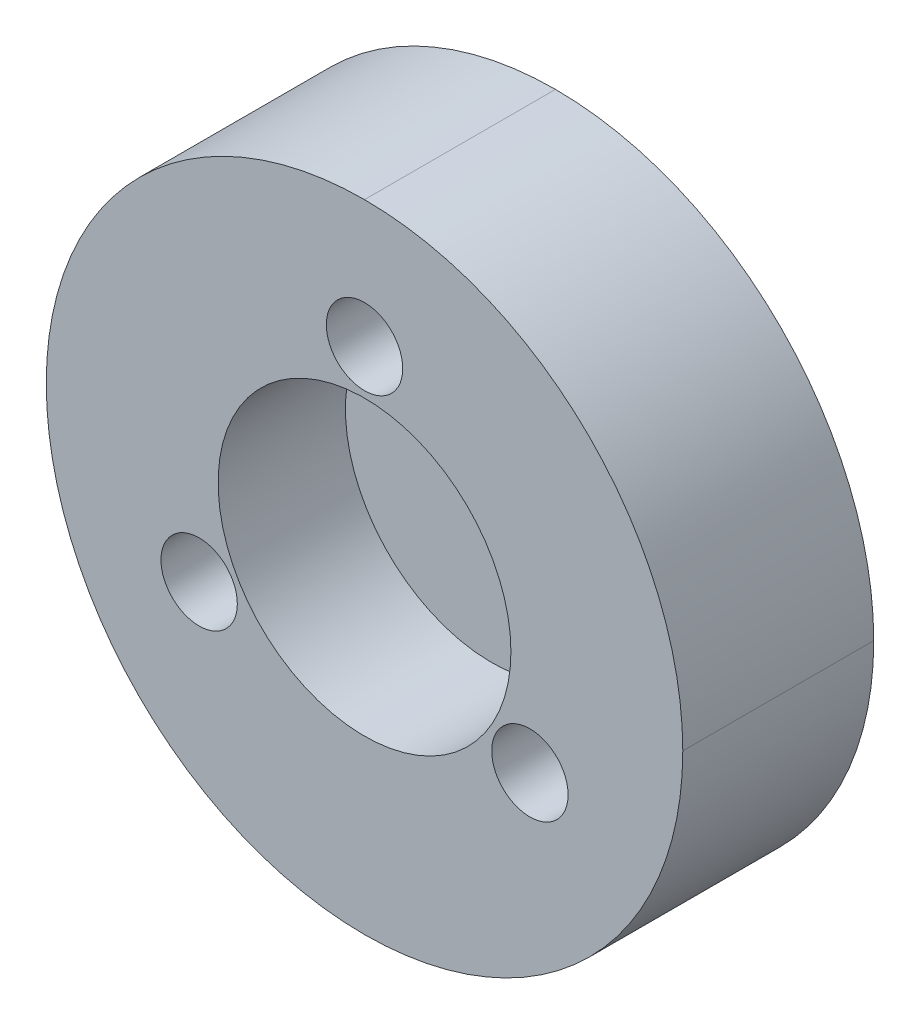
ISO-10303-21;
HEADER;
FILE_DESCRIPTION(('STEP AP214'),'2;1');
FILE_NAME('part.step','',(''),(''),'','','');
FILE_SCHEMA(('AUTOMOTIVE_DESIGN { 1 0 10303 214 1 1 1 1 }'));
ENDSEC;
DATA;
#1=APPLICATION_CONTEXT('core data for automotive mechanical design processes');
#2=APPLICATION_PROTOCOL_DEFINITION('international standard','automotive_design',2000,#1);
#3=PRODUCT_CONTEXT('',#1,'mechanical');
#4=PRODUCT('Part','Part','',(#3));
#5=PRODUCT_RELATED_PRODUCT_CATEGORY('part','',(#4));
#6=PRODUCT_DEFINITION_FORMATION('','',#4);
#7=PRODUCT_DEFINITION_CONTEXT('part definition',#1,'design');
#8=PRODUCT_DEFINITION('design','',#6,#7);
#9=PRODUCT_DEFINITION_SHAPE('','',#8);
#10=(LENGTH_UNIT() NAMED_UNIT(*) SI_UNIT(.MILLI.,.METRE.));
#11=(NAMED_UNIT(*) PLANE_ANGLE_UNIT() SI_UNIT($,.RADIAN.));
#12=(NAMED_UNIT(*) SI_UNIT($,.STERADIAN.) SOLID_ANGLE_UNIT());
#13=UNCERTAINTY_MEASURE_WITH_UNIT(LENGTH_MEASURE(1.E-05),#10,'distance_accuracy_value','');
#14=(GEOMETRIC_REPRESENTATION_CONTEXT(3) GLOBAL_UNCERTAINTY_ASSIGNED_CONTEXT((#13)) GLOBAL_UNIT_ASSIGNED_CONTEXT((#10,
#11,#12)) REPRESENTATION_CONTEXT('',''));
#15=CARTESIAN_POINT('',(0.,0.,0.));
#16=DIRECTION('',(0.,0.,1.));
#17=DIRECTION('',(1.,0.,0.));
#18=AXIS2_PLACEMENT_3D('',#15,#16,#17);
#19=CARTESIAN_POINT('',(0.,0.,6.));
#20=DIRECTION('',(0.,0.,1.));
#21=DIRECTION('',(1.,0.,0.));
#22=AXIS2_PLACEMENT_3D('',#19,#20,#21);
#23=PLANE('',#22);
#24=CARTESIAN_POINT('',(10.,10.,6.));
#25=DIRECTION('',(0.,0.,1.));
#26=DIRECTION('',(1.,0.,0.));
#27=AXIS2_PLACEMENT_3D('',#24,#25,#26);
#28=CIRCLE('',#27,4.6);
#29=CARTESIAN_POINT('',(14.6,10.,6.));
#30=VERTEX_POINT('',#29);
#31=EDGE_CURVE('E115',#30,#30,#28,.T.);
#32=ORIENTED_EDGE('',*,*,#31,.F.);
#33=EDGE_LOOP('',(#32));
#34=FACE_BOUND('',#33,.T.);
#35=CARTESIAN_POINT('',(10.,16.,6.));
#36=DIRECTION('',(0.,0.,1.));
#37=DIRECTION('',(1.,0.,0.));
#38=AXIS2_PLACEMENT_3D('',#35,#36,#37);
#39=CIRCLE('',#38,1.2);
#40=CARTESIAN_POINT('',(11.2,16.,6.));
#41=VERTEX_POINT('',#40);
#42=EDGE_CURVE('E103',#41,#41,#39,.T.);
#43=ORIENTED_EDGE('',*,*,#42,.F.);
#44=EDGE_LOOP('',(#43));
#45=FACE_BOUND('',#44,.T.);
#46=CARTESIAN_POINT('',(15.1961524227066,6.99999999999998,6.));
#47=DIRECTION('',(0.,0.,1.));
#48=DIRECTION('',(1.,0.,0.));
#49=AXIS2_PLACEMENT_3D('',#46,#47,#48);
#50=CIRCLE('',#49,1.2);
#51=CARTESIAN_POINT('',(16.3961524227066,6.99999999999998,6.));
#52=VERTEX_POINT('',#51);
#53=EDGE_CURVE('E111',#52,#52,#50,.T.);
#54=ORIENTED_EDGE('',*,*,#53,.F.);
#55=EDGE_LOOP('',(#54));
#56=FACE_BOUND('',#55,.T.);
#57=CARTESIAN_POINT('',(4.80384757729338,6.99999999999997,6.));
#58=DIRECTION('',(0.,0.,1.));
#59=DIRECTION('',(1.,0.,0.));
#60=AXIS2_PLACEMENT_3D('',#57,#58,#59);
#61=CIRCLE('',#60,1.2);
#62=CARTESIAN_POINT('',(6.00384757729338,6.99999999999997,6.));
#63=VERTEX_POINT('',#62);
#64=EDGE_CURVE('E120',#63,#63,#61,.T.);
#65=ORIENTED_EDGE('',*,*,#64,.F.);
#66=EDGE_LOOP('',(#65));
#67=FACE_BOUND('',#66,.T.);
#68=CARTESIAN_POINT('',(10.,10.,6.));
#69=DIRECTION('',(0.,0.,1.));
#70=DIRECTION('',(1.,0.,0.));
#71=AXIS2_PLACEMENT_3D('',#68,#69,#70);
#72=CIRCLE('',#71,10.);
#73=CARTESIAN_POINT('',(10.,20.,6.));
#74=VERTEX_POINT('',#73);
#75=CARTESIAN_POINT('',(0.,10.,6.));
#76=VERTEX_POINT('',#75);
#77=EDGE_CURVE('E48',#74,#76,#72,.T.);
#78=ORIENTED_EDGE('',*,*,#77,.T.);
#79=CARTESIAN_POINT('',(10.,10.,6.));
#80=DIRECTION('',(0.,0.,1.));
#81=DIRECTION('',(1.,0.,0.));
#82=AXIS2_PLACEMENT_3D('',#79,#80,#81);
#83=CIRCLE('',#82,10.);
#84=CARTESIAN_POINT('',(10.,0.,6.));
#85=VERTEX_POINT('',#84);
#86=EDGE_CURVE('E11',#76,#85,#83,.T.);
#87=ORIENTED_EDGE('',*,*,#86,.T.);
#88=CARTESIAN_POINT('',(10.,10.,6.));
#89=DIRECTION('',(0.,0.,1.));
#90=DIRECTION('',(1.,0.,0.));
#91=AXIS2_PLACEMENT_3D('',#88,#89,#90);
#92=CIRCLE('',#91,10.);
#93=CARTESIAN_POINT('',(20.,10.,6.));
#94=VERTEX_POINT('',#93);
#95=EDGE_CURVE('E41',#85,#94,#92,.T.);
#96=ORIENTED_EDGE('',*,*,#95,.T.);
#97=CARTESIAN_POINT('',(10.,10.,6.));
#98=DIRECTION('',(0.,0.,1.));
#99=DIRECTION('',(1.,0.,0.));
#100=AXIS2_PLACEMENT_3D('',#97,#98,#99);
#101=CIRCLE('',#100,10.);
#102=EDGE_CURVE('E53',#94,#74,#101,.T.);
#103=ORIENTED_EDGE('',*,*,#102,.T.);
#104=EDGE_LOOP('',(#78,#87,#96,#103));
#105=FACE_BOUND('',#104,.T.);
#106=ADVANCED_FACE('F32',(#34,#45,#56,#67,#105),#23,.T.);
#107=CARTESIAN_POINT('',(0.,0.,0.));
#108=DIRECTION('',(0.,0.,1.));
#109=DIRECTION('',(1.,0.,0.));
#110=AXIS2_PLACEMENT_3D('',#107,#108,#109);
#111=PLANE('',#110);
#112=CARTESIAN_POINT('',(10.,16.,0.));
#113=DIRECTION('',(0.,0.,1.));
#114=DIRECTION('',(1.,0.,0.));
#115=AXIS2_PLACEMENT_3D('',#112,#113,#114);
#116=CIRCLE('',#115,1.2);
#117=CARTESIAN_POINT('',(11.2,16.,0.));
#118=VERTEX_POINT('',#117);
#119=EDGE_CURVE('E106',#118,#118,#116,.T.);
#120=ORIENTED_EDGE('',*,*,#119,.T.);
#121=EDGE_LOOP('',(#120));
#122=FACE_BOUND('',#121,.T.);
#123=CARTESIAN_POINT('',(15.1961524227066,6.99999999999998,0.));
#124=DIRECTION('',(0.,0.,1.));
#125=DIRECTION('',(1.,0.,0.));
#126=AXIS2_PLACEMENT_3D('',#123,#124,#125);
#127=CIRCLE('',#126,1.2);
#128=CARTESIAN_POINT('',(16.3961524227066,6.99999999999998,0.));
#129=VERTEX_POINT('',#128);
#130=EDGE_CURVE('E119',#129,#129,#127,.T.);
#131=ORIENTED_EDGE('',*,*,#130,.T.);
#132=EDGE_LOOP('',(#131));
#133=FACE_BOUND('',#132,.T.);
#134=CARTESIAN_POINT('',(4.80384757729338,6.99999999999997,0.));
#135=DIRECTION('',(0.,0.,1.));
#136=DIRECTION('',(1.,0.,0.));
#137=AXIS2_PLACEMENT_3D('',#134,#135,#136);
#138=CIRCLE('',#137,1.2);
#139=CARTESIAN_POINT('',(6.00384757729338,6.99999999999997,0.));
#140=VERTEX_POINT('',#139);
#141=EDGE_CURVE('E123',#140,#140,#138,.T.);
#142=ORIENTED_EDGE('',*,*,#141,.T.);
#143=EDGE_LOOP('',(#142));
#144=FACE_BOUND('',#143,.T.);
#145=CARTESIAN_POINT('',(10.,10.,0.));
#146=DIRECTION('',(0.,0.,1.));
#147=DIRECTION('',(1.,0.,0.));
#148=AXIS2_PLACEMENT_3D('',#145,#146,#147);
#149=CIRCLE('',#148,10.);
#150=CARTESIAN_POINT('',(20.,10.,0.));
#151=VERTEX_POINT('',#150);
#152=CARTESIAN_POINT('',(10.,0.,0.));
#153=VERTEX_POINT('',#152);
#154=EDGE_CURVE('E74',#151,#153,#149,.F.);
#155=ORIENTED_EDGE('',*,*,#154,.T.);
#156=CARTESIAN_POINT('',(10.,10.,0.));
#157=DIRECTION('',(0.,0.,1.));
#158=DIRECTION('',(1.,0.,0.));
#159=AXIS2_PLACEMENT_3D('',#156,#157,#158);
#160=CIRCLE('',#159,10.);
#161=CARTESIAN_POINT('',(0.,10.,0.));
#162=VERTEX_POINT('',#161);
#163=EDGE_CURVE('E78',#153,#162,#160,.F.);
#164=ORIENTED_EDGE('',*,*,#163,.T.);
#165=CARTESIAN_POINT('',(10.,10.,0.));
#166=DIRECTION('',(0.,0.,1.));
#167=DIRECTION('',(1.,0.,0.));
#168=AXIS2_PLACEMENT_3D('',#165,#166,#167);
#169=CIRCLE('',#168,10.);
#170=CARTESIAN_POINT('',(10.,20.,0.));
#171=VERTEX_POINT('',#170);
#172=EDGE_CURVE('E126',#162,#171,#169,.F.);
#173=ORIENTED_EDGE('',*,*,#172,.T.);
#174=CARTESIAN_POINT('',(10.,10.,0.));
#175=DIRECTION('',(0.,0.,1.));
#176=DIRECTION('',(1.,0.,0.));
#177=AXIS2_PLACEMENT_3D('',#174,#175,#176);
#178=CIRCLE('',#177,10.);
#179=EDGE_CURVE('E80',#171,#151,#178,.F.);
#180=ORIENTED_EDGE('',*,*,#179,.T.);
#181=EDGE_LOOP('',(#155,#164,#173,#180));
#182=FACE_BOUND('',#181,.T.);
#183=ADVANCED_FACE('F76',(#122,#133,#144,#182),#111,.F.);
#184=CARTESIAN_POINT('',(4.80384757729338,6.99999999999997,6.));
#185=DIRECTION('',(0.,0.,1.));
#186=DIRECTION('',(1.,0.,0.));
#187=AXIS2_PLACEMENT_3D('',#184,#185,#186);
#188=CYLINDRICAL_SURFACE('',#187,1.2);
#189=ORIENTED_EDGE('',*,*,#64,.T.);
#190=EDGE_LOOP('',(#189));
#191=FACE_BOUND('',#190,.T.);
#192=ORIENTED_EDGE('',*,*,#141,.F.);
#193=EDGE_LOOP('',(#192));
#194=FACE_BOUND('',#193,.T.);
#195=ADVANCED_FACE('F137',(#191,#194),#188,.F.);
#196=CARTESIAN_POINT('',(15.1961524227066,6.99999999999998,6.));
#197=DIRECTION('',(0.,0.,1.));
#198=DIRECTION('',(1.,0.,0.));
#199=AXIS2_PLACEMENT_3D('',#196,#197,#198);
#200=CYLINDRICAL_SURFACE('',#199,1.2);
#201=ORIENTED_EDGE('',*,*,#53,.T.);
#202=EDGE_LOOP('',(#201));
#203=FACE_BOUND('',#202,.T.);
#204=ORIENTED_EDGE('',*,*,#130,.F.);
#205=EDGE_LOOP('',(#204));
#206=FACE_BOUND('',#205,.T.);
#207=ADVANCED_FACE('F157',(#203,#206),#200,.F.);
#208=CARTESIAN_POINT('',(10.,16.,6.));
#209=DIRECTION('',(0.,0.,1.));
#210=DIRECTION('',(1.,0.,0.));
#211=AXIS2_PLACEMENT_3D('',#208,#209,#210);
#212=CYLINDRICAL_SURFACE('',#211,1.2);
#213=ORIENTED_EDGE('',*,*,#42,.T.);
#214=EDGE_LOOP('',(#213));
#215=FACE_BOUND('',#214,.T.);
#216=ORIENTED_EDGE('',*,*,#119,.F.);
#217=EDGE_LOOP('',(#216));
#218=FACE_BOUND('',#217,.T.);
#219=ADVANCED_FACE('F153',(#215,#218),#212,.F.);
#220=CARTESIAN_POINT('',(10.,10.,6.));
#221=DIRECTION('',(0.,0.,1.));
#222=DIRECTION('',(1.,0.,0.));
#223=AXIS2_PLACEMENT_3D('',#220,#221,#222);
#224=CYLINDRICAL_SURFACE('',#223,10.);
#225=DIRECTION('',(0.,0.,-1.));
#226=VECTOR('',#225,1.);
#227=CARTESIAN_POINT('',(20.,10.,6.));
#228=LINE('',#227,#226);
#229=EDGE_CURVE('E101',#151,#94,#228,.F.);
#230=ORIENTED_EDGE('',*,*,#229,.F.);
#231=ORIENTED_EDGE('',*,*,#179,.F.);
#232=DIRECTION('',(0.,0.,-1.));
#233=VECTOR('',#232,1.);
#234=CARTESIAN_POINT('',(10.,20.,0.));
#235=LINE('',#234,#233);
#236=EDGE_CURVE('E36',#74,#171,#235,.T.);
#237=ORIENTED_EDGE('',*,*,#236,.F.);
#238=ORIENTED_EDGE('',*,*,#102,.F.);
#239=EDGE_LOOP('',(#230,#231,#237,#238));
#240=FACE_BOUND('',#239,.T.);
#241=ADVANCED_FACE('F34',(#240),#224,.T.);
#242=CARTESIAN_POINT('',(10.,10.,6.));
#243=DIRECTION('',(0.,0.,-1.));
#244=DIRECTION('',(-1.,0.,0.));
#245=AXIS2_PLACEMENT_3D('',#242,#243,#244);
#246=CYLINDRICAL_SURFACE('',#245,10.);
#247=ORIENTED_EDGE('',*,*,#236,.T.);
#248=ORIENTED_EDGE('',*,*,#172,.F.);
#249=DIRECTION('',(0.,0.,-1.));
#250=VECTOR('',#249,1.);
#251=CARTESIAN_POINT('',(0.,10.,6.));
#252=LINE('',#251,#250);
#253=EDGE_CURVE('E90',#76,#162,#252,.T.);
#254=ORIENTED_EDGE('',*,*,#253,.F.);
#255=ORIENTED_EDGE('',*,*,#77,.F.);
#256=EDGE_LOOP('',(#247,#248,#254,#255));
#257=FACE_BOUND('',#256,.T.);
#258=ADVANCED_FACE('F130',(#257),#246,.T.);
#259=CARTESIAN_POINT('',(10.,10.,6.));
#260=DIRECTION('',(0.,0.,-1.));
#261=DIRECTION('',(-1.,0.,0.));
#262=AXIS2_PLACEMENT_3D('',#259,#260,#261);
#263=CYLINDRICAL_SURFACE('',#262,10.);
#264=ORIENTED_EDGE('',*,*,#229,.T.);
#265=ORIENTED_EDGE('',*,*,#95,.F.);
#266=DIRECTION('',(0.,0.,-1.));
#267=VECTOR('',#266,1.);
#268=CARTESIAN_POINT('',(10.,0.,6.));
#269=LINE('',#268,#267);
#270=EDGE_CURVE('E86',#153,#85,#269,.F.);
#271=ORIENTED_EDGE('',*,*,#270,.F.);
#272=ORIENTED_EDGE('',*,*,#154,.F.);
#273=EDGE_LOOP('',(#264,#265,#271,#272));
#274=FACE_BOUND('',#273,.T.);
#275=ADVANCED_FACE('F87',(#274),#263,.T.);
#276=CARTESIAN_POINT('',(10.,10.,6.));
#277=DIRECTION('',(0.,0.,1.));
#278=DIRECTION('',(1.,0.,0.));
#279=AXIS2_PLACEMENT_3D('',#276,#277,#278);
#280=CYLINDRICAL_SURFACE('',#279,10.);
#281=ORIENTED_EDGE('',*,*,#86,.F.);
#282=ORIENTED_EDGE('',*,*,#253,.T.);
#283=ORIENTED_EDGE('',*,*,#163,.F.);
#284=ORIENTED_EDGE('',*,*,#270,.T.);
#285=EDGE_LOOP('',(#281,#282,#283,#284));
#286=FACE_BOUND('',#285,.T.);
#287=ADVANCED_FACE('F93',(#286),#280,.T.);
#288=CARTESIAN_POINT('',(10.,10.,2.));
#289=DIRECTION('',(0.,0.,1.));
#290=DIRECTION('',(1.,0.,0.));
#291=AXIS2_PLACEMENT_3D('',#288,#289,#290);
#292=CYLINDRICAL_SURFACE('',#291,4.6);
#293=CARTESIAN_POINT('',(10.,10.,2.));
#294=DIRECTION('',(0.,0.,1.));
#295=DIRECTION('',(1.,0.,0.));
#296=AXIS2_PLACEMENT_3D('',#293,#294,#295);
#297=CIRCLE('',#296,4.6);
#298=CARTESIAN_POINT('',(14.6,10.,2.));
#299=VERTEX_POINT('',#298);
#300=EDGE_CURVE('E91',#299,#299,#297,.T.);
#301=ORIENTED_EDGE('',*,*,#300,.F.);
#302=EDGE_LOOP('',(#301));
#303=FACE_BOUND('',#302,.T.);
#304=ORIENTED_EDGE('',*,*,#31,.T.);
#305=EDGE_LOOP('',(#304));
#306=FACE_BOUND('',#305,.T.);
#307=ADVANCED_FACE('F147',(#303,#306),#292,.F.);
#308=CARTESIAN_POINT('',(10.,10.,2.));
#309=DIRECTION('',(0.,0.,1.));
#310=DIRECTION('',(1.,0.,0.));
#311=AXIS2_PLACEMENT_3D('',#308,#309,#310);
#312=PLANE('',#311);
#313=ORIENTED_EDGE('',*,*,#300,.T.);
#314=EDGE_LOOP('',(#313));
#315=FACE_BOUND('',#314,.T.);
#316=ADVANCED_FACE('F167',(#315),#312,.T.);
#317=CLOSED_SHELL('',(#106,#183,#195,#207,#219,#241,#258,#275,#287,#307,#316));
#318=MANIFOLD_SOLID_BREP('B2',#317);
#319=ADVANCED_BREP_SHAPE_REPRESENTATION('',(#18,#318),#14);
#320=SHAPE_DEFINITION_REPRESENTATION(#9,#319);
ENDSEC;
END-ISO-10303-21;
